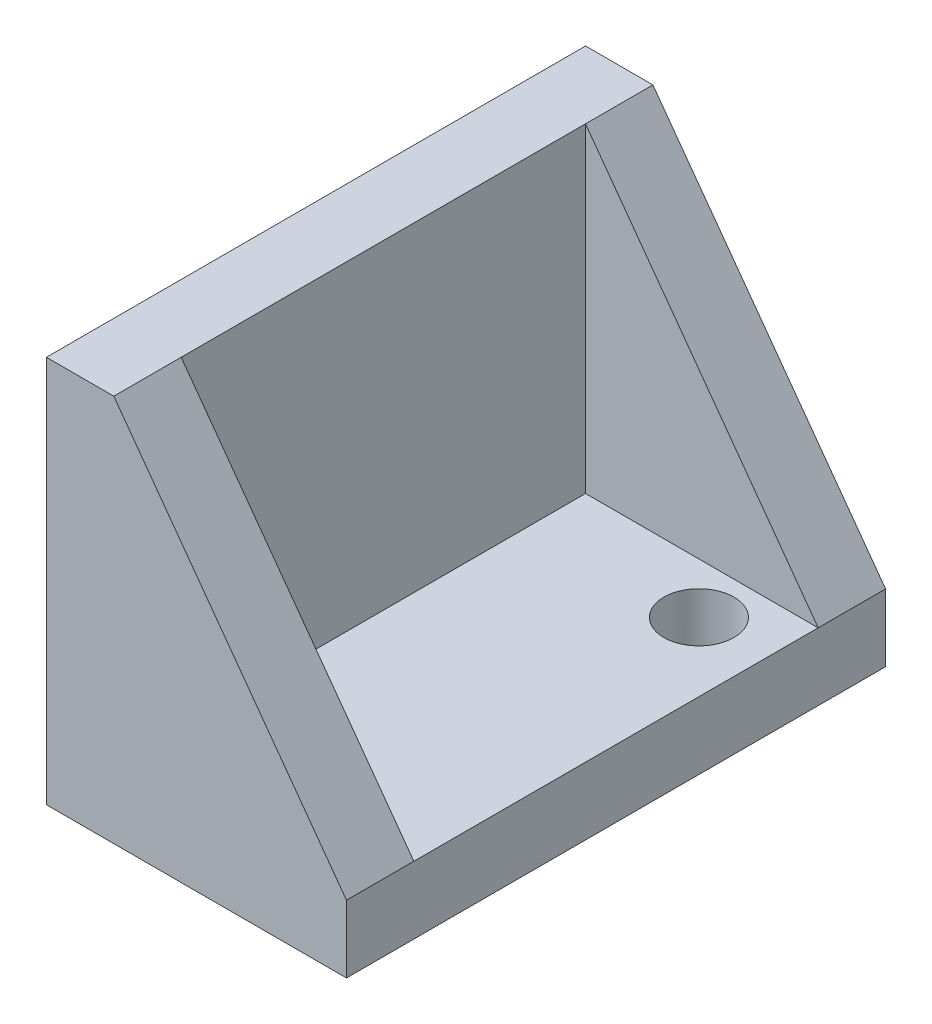
ISO-10303-21;
HEADER;
FILE_DESCRIPTION(('STEP AP214'),'2;1');
FILE_NAME('part.step','',(''),(''),'','','');
FILE_SCHEMA(('AUTOMOTIVE_DESIGN { 1 0 10303 214 1 1 1 1 }'));
ENDSEC;
DATA;
#1=APPLICATION_CONTEXT('core data for automotive mechanical design processes');
#2=APPLICATION_PROTOCOL_DEFINITION('international standard','automotive_design',2000,#1);
#3=PRODUCT_CONTEXT('',#1,'mechanical');
#4=PRODUCT('Part','Part','',(#3));
#5=PRODUCT_RELATED_PRODUCT_CATEGORY('part','',(#4));
#6=PRODUCT_DEFINITION_FORMATION('','',#4);
#7=PRODUCT_DEFINITION_CONTEXT('part definition',#1,'design');
#8=PRODUCT_DEFINITION('design','',#6,#7);
#9=PRODUCT_DEFINITION_SHAPE('','',#8);
#10=(LENGTH_UNIT() NAMED_UNIT(*) SI_UNIT(.MILLI.,.METRE.));
#11=(NAMED_UNIT(*) PLANE_ANGLE_UNIT() SI_UNIT($,.RADIAN.));
#12=(NAMED_UNIT(*) SI_UNIT($,.STERADIAN.) SOLID_ANGLE_UNIT());
#13=UNCERTAINTY_MEASURE_WITH_UNIT(LENGTH_MEASURE(1.E-05),#10,'distance_accuracy_value','');
#14=(GEOMETRIC_REPRESENTATION_CONTEXT(3) GLOBAL_UNCERTAINTY_ASSIGNED_CONTEXT((#13)) GLOBAL_UNIT_ASSIGNED_CONTEXT((#10,
#11,#12)) REPRESENTATION_CONTEXT('',''));
#15=CARTESIAN_POINT('',(0.,0.,0.));
#16=DIRECTION('',(0.,0.,1.));
#17=DIRECTION('',(1.,0.,0.));
#18=AXIS2_PLACEMENT_3D('',#15,#16,#17);
#19=CARTESIAN_POINT('',(130.604002291105,118.048344881126,1057.012834154));
#20=DIRECTION('',(1.,0.,0.));
#21=DIRECTION('',(0.,0.,-1.));
#22=AXIS2_PLACEMENT_3D('',#19,#20,#21);
#23=PLANE('',#22);
#24=DIRECTION('',(0.,-1.,0.));
#25=VECTOR('',#24,1.);
#26=CARTESIAN_POINT('',(130.604002291105,118.048344881126,1101.462834154));
#27=LINE('',#26,#25);
#28=CARTESIAN_POINT('',(130.604002291105,118.048344881126,1101.462834154));
#29=VERTEX_POINT('',#28);
#30=CARTESIAN_POINT('',(130.604002291105,87.8815745540004,1101.462834154));
#31=VERTEX_POINT('',#30);
#32=EDGE_CURVE('E179',#29,#31,#27,.T.);
#33=ORIENTED_EDGE('',*,*,#32,.T.);
#34=DIRECTION('',(0.,0.,1.));
#35=VECTOR('',#34,1.);
#36=CARTESIAN_POINT('',(130.604002291105,87.8815745540004,1057.012834154));
#37=LINE('',#36,#35);
#38=CARTESIAN_POINT('',(130.604002291105,87.8815745540004,1063.362834154));
#39=VERTEX_POINT('',#38);
#40=EDGE_CURVE('E148',#39,#31,#37,.T.);
#41=ORIENTED_EDGE('',*,*,#40,.F.);
#42=DIRECTION('',(0.,-1.,0.));
#43=VECTOR('',#42,1.);
#44=CARTESIAN_POINT('',(130.604002291105,118.048344881126,1063.362834154));
#45=LINE('',#44,#43);
#46=CARTESIAN_POINT('',(130.604002291105,118.048344881126,1063.362834154));
#47=VERTEX_POINT('',#46);
#48=EDGE_CURVE('E56',#47,#39,#45,.T.);
#49=ORIENTED_EDGE('',*,*,#48,.F.);
#50=DIRECTION('',(0.,0.,1.));
#51=VECTOR('',#50,1.);
#52=CARTESIAN_POINT('',(130.604002291105,118.048344881126,1057.012834154));
#53=LINE('',#52,#51);
#54=EDGE_CURVE('E147',#47,#29,#53,.T.);
#55=ORIENTED_EDGE('',*,*,#54,.T.);
#56=EDGE_LOOP('',(#33,#41,#49,#55));
#57=FACE_BOUND('',#56,.T.);
#58=ADVANCED_FACE('F39',(#57),#23,.T.);
#59=CARTESIAN_POINT('',(152.527062484,87.8815745540004,1057.012834154));
#60=DIRECTION('',(0.,1.,0.));
#61=DIRECTION('',(0.,0.,1.));
#62=AXIS2_PLACEMENT_3D('',#59,#60,#61);
#63=PLANE('',#62);
#64=DIRECTION('',(1.,0.,0.));
#65=VECTOR('',#64,1.);
#66=CARTESIAN_POINT('',(152.527062484,87.8815745540004,1101.462834154));
#67=LINE('',#66,#65);
#68=CARTESIAN_POINT('',(152.527062484,87.8815745540004,1101.462834154));
#69=VERTEX_POINT('',#68);
#70=EDGE_CURVE('E176',#31,#69,#67,.T.);
#71=ORIENTED_EDGE('',*,*,#70,.T.);
#72=DIRECTION('',(0.,0.,1.));
#73=VECTOR('',#72,1.);
#74=CARTESIAN_POINT('',(152.527062484,87.8815745540004,1057.012834154));
#75=LINE('',#74,#73);
#76=CARTESIAN_POINT('',(152.527062484,87.8815745540004,1063.362834154));
#77=VERTEX_POINT('',#76);
#78=EDGE_CURVE('E126',#77,#69,#75,.T.);
#79=ORIENTED_EDGE('',*,*,#78,.F.);
#80=DIRECTION('',(1.,0.,0.));
#81=VECTOR('',#80,1.);
#82=CARTESIAN_POINT('',(152.527062484,87.8815745540004,1063.362834154));
#83=LINE('',#82,#81);
#84=EDGE_CURVE('E64',#39,#77,#83,.T.);
#85=ORIENTED_EDGE('',*,*,#84,.F.);
#86=ORIENTED_EDGE('',*,*,#40,.T.);
#87=EDGE_LOOP('',(#71,#79,#85,#86));
#88=FACE_BOUND('',#87,.T.);
#89=CARTESIAN_POINT('',(146.050062484,87.8815745540004,1068.125334154));
#90=DIRECTION('',(0.,1.,0.));
#91=DIRECTION('',(0.,0.,1.));
#92=AXIS2_PLACEMENT_3D('',#89,#90,#91);
#93=CIRCLE('',#92,3.30199999999995);
#94=CARTESIAN_POINT('',(146.050062484,87.8815745540004,1071.427334154));
#95=VERTEX_POINT('',#94);
#96=EDGE_CURVE('E43',#95,#95,#93,.F.);
#97=ORIENTED_EDGE('',*,*,#96,.T.);
#98=EDGE_LOOP('',(#97));
#99=FACE_BOUND('',#98,.T.);
#100=ADVANCED_FACE('F183',(#88,#99),#63,.T.);
#101=CARTESIAN_POINT('',(124.254002291105,81.5315745540004,1057.012834154));
#102=DIRECTION('',(0.,-1.,0.));
#103=DIRECTION('',(0.,0.,-1.));
#104=AXIS2_PLACEMENT_3D('',#101,#102,#103);
#105=PLANE('',#104);
#106=CARTESIAN_POINT('',(146.050062484,81.5315745540004,1068.125334154));
#107=DIRECTION('',(0.,-1.,0.));
#108=DIRECTION('',(0.,0.,-1.));
#109=AXIS2_PLACEMENT_3D('',#106,#107,#108);
#110=CIRCLE('',#109,3.30199999999995);
#111=CARTESIAN_POINT('',(146.050062484,81.5315745540004,1064.823334154));
#112=VERTEX_POINT('',#111);
#113=EDGE_CURVE('E137',#112,#112,#110,.F.);
#114=ORIENTED_EDGE('',*,*,#113,.T.);
#115=EDGE_LOOP('',(#114));
#116=FACE_BOUND('',#115,.T.);
#117=DIRECTION('',(1.,0.,0.));
#118=VECTOR('',#117,1.);
#119=CARTESIAN_POINT('',(124.254002291105,81.5315745540004,1107.812834154));
#120=LINE('',#119,#118);
#121=CARTESIAN_POINT('',(124.254002291105,81.5315745540004,1107.812834154));
#122=VERTEX_POINT('',#121);
#123=CARTESIAN_POINT('',(152.527062484,81.5315745540004,1107.812834154));
#124=VERTEX_POINT('',#123);
#125=EDGE_CURVE('E132',#122,#124,#120,.T.);
#126=ORIENTED_EDGE('',*,*,#125,.F.);
#127=DIRECTION('',(0.,0.,1.));
#128=VECTOR('',#127,1.);
#129=CARTESIAN_POINT('',(124.254002291105,81.5315745540004,1057.012834154));
#130=LINE('',#129,#128);
#131=CARTESIAN_POINT('',(124.254002291105,81.5315745540004,1057.012834154));
#132=VERTEX_POINT('',#131);
#133=EDGE_CURVE('E11',#132,#122,#130,.T.);
#134=ORIENTED_EDGE('',*,*,#133,.F.);
#135=DIRECTION('',(1.,0.,0.));
#136=VECTOR('',#135,1.);
#137=CARTESIAN_POINT('',(124.254002291105,81.5315745540004,1057.012834154));
#138=LINE('',#137,#136);
#139=CARTESIAN_POINT('',(152.527062484,81.5315745540004,1057.012834154));
#140=VERTEX_POINT('',#139);
#141=EDGE_CURVE('E141',#132,#140,#138,.T.);
#142=ORIENTED_EDGE('',*,*,#141,.T.);
#143=DIRECTION('',(0.,0.,1.));
#144=VECTOR('',#143,1.);
#145=CARTESIAN_POINT('',(152.527062484,81.5315745540004,1057.012834154));
#146=LINE('',#145,#144);
#147=EDGE_CURVE('E151',#140,#124,#146,.T.);
#148=ORIENTED_EDGE('',*,*,#147,.T.);
#149=EDGE_LOOP('',(#126,#134,#142,#148));
#150=FACE_BOUND('',#149,.T.);
#151=ADVANCED_FACE('F41',(#116,#150),#105,.T.);
#152=CARTESIAN_POINT('',(124.254002291105,81.5315745540004,1057.012834154));
#153=DIRECTION('',(-1.,0.,0.));
#154=DIRECTION('',(0.,0.,1.));
#155=AXIS2_PLACEMENT_3D('',#152,#153,#154);
#156=PLANE('',#155);
#157=DIRECTION('',(0.,-1.,0.));
#158=VECTOR('',#157,1.);
#159=CARTESIAN_POINT('',(124.254002291105,81.5315745540004,1107.812834154));
#160=LINE('',#159,#158);
#161=CARTESIAN_POINT('',(124.254002291105,118.048344881126,1107.812834154));
#162=VERTEX_POINT('',#161);
#163=EDGE_CURVE('E135',#162,#122,#160,.T.);
#164=ORIENTED_EDGE('',*,*,#163,.F.);
#165=DIRECTION('',(0.,0.,1.));
#166=VECTOR('',#165,1.);
#167=CARTESIAN_POINT('',(124.254002291105,118.048344881126,1057.012834154));
#168=LINE('',#167,#166);
#169=CARTESIAN_POINT('',(124.254002291105,118.048344881126,1057.012834154));
#170=VERTEX_POINT('',#169);
#171=EDGE_CURVE('E48',#170,#162,#168,.T.);
#172=ORIENTED_EDGE('',*,*,#171,.F.);
#173=DIRECTION('',(0.,-1.,0.));
#174=VECTOR('',#173,1.);
#175=CARTESIAN_POINT('',(124.254002291105,81.5315745540004,1057.012834154));
#176=LINE('',#175,#174);
#177=EDGE_CURVE('E152',#170,#132,#176,.T.);
#178=ORIENTED_EDGE('',*,*,#177,.T.);
#179=ORIENTED_EDGE('',*,*,#133,.T.);
#180=EDGE_LOOP('',(#164,#172,#178,#179));
#181=FACE_BOUND('',#180,.T.);
#182=ADVANCED_FACE('F212',(#181),#156,.T.);
#183=CARTESIAN_POINT('',(124.254002291105,118.048344881126,1057.012834154));
#184=DIRECTION('',(0.,1.,0.));
#185=DIRECTION('',(0.,0.,1.));
#186=AXIS2_PLACEMENT_3D('',#183,#184,#185);
#187=PLANE('',#186);
#188=DIRECTION('',(-1.,0.,0.));
#189=VECTOR('',#188,1.);
#190=CARTESIAN_POINT('',(124.254002291105,118.048344881126,1107.812834154));
#191=LINE('',#190,#189);
#192=CARTESIAN_POINT('',(130.604002291105,118.048344881126,1107.812834154));
#193=VERTEX_POINT('',#192);
#194=EDGE_CURVE('E133',#193,#162,#191,.T.);
#195=ORIENTED_EDGE('',*,*,#194,.F.);
#196=DIRECTION('',(0.,0.,-1.));
#197=VECTOR('',#196,1.);
#198=CARTESIAN_POINT('',(130.604002291105,118.048344881126,1107.812834154));
#199=LINE('',#198,#197);
#200=EDGE_CURVE('E112',#193,#29,#199,.T.);
#201=ORIENTED_EDGE('',*,*,#200,.T.);
#202=ORIENTED_EDGE('',*,*,#54,.F.);
#203=CARTESIAN_POINT('',(130.604002291105,118.048344881126,1057.012834154));
#204=VERTEX_POINT('',#203);
#205=EDGE_CURVE('E144',#204,#47,#53,.T.);
#206=ORIENTED_EDGE('',*,*,#205,.F.);
#207=DIRECTION('',(-1.,0.,0.));
#208=VECTOR('',#207,1.);
#209=CARTESIAN_POINT('',(124.254002291105,118.048344881126,1057.012834154));
#210=LINE('',#209,#208);
#211=EDGE_CURVE('E156',#204,#170,#210,.T.);
#212=ORIENTED_EDGE('',*,*,#211,.T.);
#213=ORIENTED_EDGE('',*,*,#171,.T.);
#214=EDGE_LOOP('',(#195,#201,#202,#206,#212,#213));
#215=FACE_BOUND('',#214,.T.);
#216=ADVANCED_FACE('F201',(#215),#187,.T.);
#217=CARTESIAN_POINT('',(152.527062484,81.5315745540004,1057.012834154));
#218=DIRECTION('',(1.,0.,0.));
#219=DIRECTION('',(0.,0.,-1.));
#220=AXIS2_PLACEMENT_3D('',#217,#218,#219);
#221=PLANE('',#220);
#222=DIRECTION('',(0.,1.,0.));
#223=VECTOR('',#222,1.);
#224=CARTESIAN_POINT('',(152.527062484,81.5315745540004,1107.812834154));
#225=LINE('',#224,#223);
#226=CARTESIAN_POINT('',(152.527062484,87.8815745540004,1107.812834154));
#227=VERTEX_POINT('',#226);
#228=EDGE_CURVE('E123',#124,#227,#225,.T.);
#229=ORIENTED_EDGE('',*,*,#228,.F.);
#230=ORIENTED_EDGE('',*,*,#147,.F.);
#231=DIRECTION('',(0.,1.,0.));
#232=VECTOR('',#231,1.);
#233=CARTESIAN_POINT('',(152.527062484,81.5315745540004,1057.012834154));
#234=LINE('',#233,#232);
#235=CARTESIAN_POINT('',(152.527062484,87.8815745540004,1057.012834154));
#236=VERTEX_POINT('',#235);
#237=EDGE_CURVE('E160',#140,#236,#234,.T.);
#238=ORIENTED_EDGE('',*,*,#237,.T.);
#239=EDGE_CURVE('E150',#236,#77,#75,.T.);
#240=ORIENTED_EDGE('',*,*,#239,.T.);
#241=ORIENTED_EDGE('',*,*,#78,.T.);
#242=DIRECTION('',(0.,0.,-1.));
#243=VECTOR('',#242,1.);
#244=CARTESIAN_POINT('',(152.527062484,87.8815745540004,1107.812834154));
#245=LINE('',#244,#243);
#246=EDGE_CURVE('E109',#227,#69,#245,.T.);
#247=ORIENTED_EDGE('',*,*,#246,.F.);
#248=EDGE_LOOP('',(#229,#230,#238,#240,#241,#247));
#249=FACE_BOUND('',#248,.T.);
#250=ADVANCED_FACE('F122',(#249),#221,.T.);
#251=CARTESIAN_POINT('',(0.,0.,1057.012834154));
#252=DIRECTION('',(0.,0.,1.));
#253=DIRECTION('',(1.,0.,0.));
#254=AXIS2_PLACEMENT_3D('',#251,#252,#253);
#255=PLANE('',#254);
#256=ORIENTED_EDGE('',*,*,#211,.F.);
#257=DIRECTION('',(-0.58788386114391,0.808945341668106,0.));
#258=VECTOR('',#257,1.);
#259=CARTESIAN_POINT('',(130.604002291105,118.048344881126,1057.012834154));
#260=LINE('',#259,#258);
#261=EDGE_CURVE('E127',#236,#204,#260,.T.);
#262=ORIENTED_EDGE('',*,*,#261,.F.);
#263=ORIENTED_EDGE('',*,*,#237,.F.);
#264=ORIENTED_EDGE('',*,*,#141,.F.);
#265=ORIENTED_EDGE('',*,*,#177,.F.);
#266=EDGE_LOOP('',(#256,#262,#263,#264,#265));
#267=FACE_BOUND('',#266,.T.);
#268=ADVANCED_FACE('F204',(#267),#255,.F.);
#269=CARTESIAN_POINT('',(0.,0.,1107.812834154));
#270=DIRECTION('',(0.,0.,1.));
#271=DIRECTION('',(1.,0.,0.));
#272=AXIS2_PLACEMENT_3D('',#269,#270,#271);
#273=PLANE('',#272);
#274=DIRECTION('',(-0.58788386114391,0.808945341668106,0.));
#275=VECTOR('',#274,1.);
#276=CARTESIAN_POINT('',(130.604002291105,118.048344881126,1107.812834154));
#277=LINE('',#276,#275);
#278=EDGE_CURVE('E106',#227,#193,#277,.T.);
#279=ORIENTED_EDGE('',*,*,#278,.T.);
#280=ORIENTED_EDGE('',*,*,#194,.T.);
#281=ORIENTED_EDGE('',*,*,#163,.T.);
#282=ORIENTED_EDGE('',*,*,#125,.T.);
#283=ORIENTED_EDGE('',*,*,#228,.T.);
#284=EDGE_LOOP('',(#279,#280,#281,#282,#283));
#285=FACE_BOUND('',#284,.T.);
#286=ADVANCED_FACE('F129',(#285),#273,.T.);
#287=CARTESIAN_POINT('',(146.050062484,81.5315745540004,1068.125334154));
#288=DIRECTION('',(0.,-1.,0.));
#289=DIRECTION('',(0.,0.,-1.));
#290=AXIS2_PLACEMENT_3D('',#287,#288,#289);
#291=CYLINDRICAL_SURFACE('',#290,3.30199999999995);
#292=ORIENTED_EDGE('',*,*,#113,.F.);
#293=EDGE_LOOP('',(#292));
#294=FACE_BOUND('',#293,.T.);
#295=ORIENTED_EDGE('',*,*,#96,.F.);
#296=EDGE_LOOP('',(#295));
#297=FACE_BOUND('',#296,.T.);
#298=ADVANCED_FACE('F226',(#294,#297),#291,.F.);
#299=CARTESIAN_POINT('',(130.604002291105,118.048344881126,1063.362834154));
#300=DIRECTION('',(-0.808945341668106,-0.587883861143909,0.));
#301=DIRECTION('',(0.58788386114391,-0.808945341668106,0.));
#302=AXIS2_PLACEMENT_3D('',#299,#300,#301);
#303=PLANE('',#302);
#304=ORIENTED_EDGE('',*,*,#261,.T.);
#305=ORIENTED_EDGE('',*,*,#205,.T.);
#306=DIRECTION('',(-0.58788386114391,0.808945341668106,0.));
#307=VECTOR('',#306,1.);
#308=CARTESIAN_POINT('',(130.604002291105,118.048344881126,1063.362834154));
#309=LINE('',#308,#307);
#310=EDGE_CURVE('E169',#77,#47,#309,.T.);
#311=ORIENTED_EDGE('',*,*,#310,.F.);
#312=ORIENTED_EDGE('',*,*,#239,.F.);
#313=EDGE_LOOP('',(#304,#305,#311,#312));
#314=FACE_BOUND('',#313,.T.);
#315=ADVANCED_FACE('F228',(#314),#303,.F.);
#316=CARTESIAN_POINT('',(0.,0.,1063.362834154));
#317=DIRECTION('',(0.,0.,-1.));
#318=DIRECTION('',(-1.,0.,0.));
#319=AXIS2_PLACEMENT_3D('',#316,#317,#318);
#320=PLANE('',#319);
#321=ORIENTED_EDGE('',*,*,#48,.T.);
#322=ORIENTED_EDGE('',*,*,#84,.T.);
#323=ORIENTED_EDGE('',*,*,#310,.T.);
#324=EDGE_LOOP('',(#321,#322,#323));
#325=FACE_BOUND('',#324,.T.);
#326=ADVANCED_FACE('F191',(#325),#320,.F.);
#327=CARTESIAN_POINT('',(130.604002291105,118.048344881126,1107.812834154));
#328=DIRECTION('',(-0.808945341668106,-0.587883861143909,0.));
#329=DIRECTION('',(0.58788386114391,-0.808945341668106,0.));
#330=AXIS2_PLACEMENT_3D('',#327,#328,#329);
#331=PLANE('',#330);
#332=DIRECTION('',(-0.58788386114391,0.808945341668106,0.));
#333=VECTOR('',#332,1.);
#334=CARTESIAN_POINT('',(130.604002291105,118.048344881126,1101.462834154));
#335=LINE('',#334,#333);
#336=EDGE_CURVE('E117',#69,#29,#335,.T.);
#337=ORIENTED_EDGE('',*,*,#336,.T.);
#338=ORIENTED_EDGE('',*,*,#200,.F.);
#339=ORIENTED_EDGE('',*,*,#278,.F.);
#340=ORIENTED_EDGE('',*,*,#246,.T.);
#341=EDGE_LOOP('',(#337,#338,#339,#340));
#342=FACE_BOUND('',#341,.T.);
#343=ADVANCED_FACE('F108',(#342),#331,.F.);
#344=CARTESIAN_POINT('',(0.,0.,1101.462834154));
#345=DIRECTION('',(0.,0.,-1.));
#346=DIRECTION('',(-1.,0.,0.));
#347=AXIS2_PLACEMENT_3D('',#344,#345,#346);
#348=PLANE('',#347);
#349=ORIENTED_EDGE('',*,*,#32,.F.);
#350=ORIENTED_EDGE('',*,*,#336,.F.);
#351=ORIENTED_EDGE('',*,*,#70,.F.);
#352=EDGE_LOOP('',(#349,#350,#351));
#353=FACE_BOUND('',#352,.T.);
#354=ADVANCED_FACE('F185',(#353),#348,.T.);
#355=CLOSED_SHELL('',(#58,#100,#151,#182,#216,#250,#268,#286,#298,#315,#326,#343,#354));
#356=MANIFOLD_SOLID_BREP('B2',#355);
#357=ADVANCED_BREP_SHAPE_REPRESENTATION('',(#18,#356),#14);
#358=SHAPE_DEFINITION_REPRESENTATION(#9,#357);
ENDSEC;
END-ISO-10303-21;
